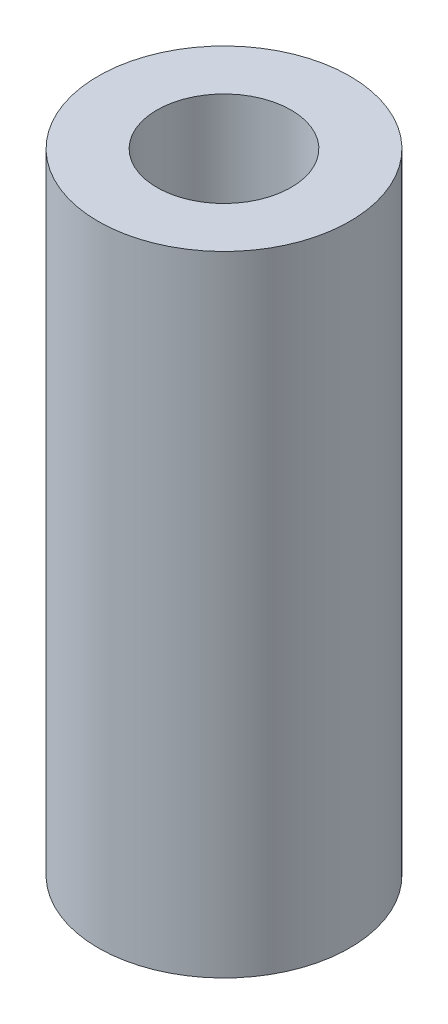
ISO-10303-21;
HEADER;
FILE_DESCRIPTION(('STEP AP214'),'2;1');
FILE_NAME('part.step','',(''),(''),'','','');
FILE_SCHEMA(('AUTOMOTIVE_DESIGN { 1 0 10303 214 1 1 1 1 }'));
ENDSEC;
DATA;
#1=APPLICATION_CONTEXT('core data for automotive mechanical design processes');
#2=APPLICATION_PROTOCOL_DEFINITION('international standard','automotive_design',2000,#1);
#3=PRODUCT_CONTEXT('',#1,'mechanical');
#4=PRODUCT('Part','Part','',(#3));
#5=PRODUCT_RELATED_PRODUCT_CATEGORY('part','',(#4));
#6=PRODUCT_DEFINITION_FORMATION('','',#4);
#7=PRODUCT_DEFINITION_CONTEXT('part definition',#1,'design');
#8=PRODUCT_DEFINITION('design','',#6,#7);
#9=PRODUCT_DEFINITION_SHAPE('','',#8);
#10=(LENGTH_UNIT() NAMED_UNIT(*) SI_UNIT(.MILLI.,.METRE.));
#11=(NAMED_UNIT(*) PLANE_ANGLE_UNIT() SI_UNIT($,.RADIAN.));
#12=(NAMED_UNIT(*) SI_UNIT($,.STERADIAN.) SOLID_ANGLE_UNIT());
#13=UNCERTAINTY_MEASURE_WITH_UNIT(LENGTH_MEASURE(1.E-05),#10,'distance_accuracy_value','');
#14=(GEOMETRIC_REPRESENTATION_CONTEXT(3) GLOBAL_UNCERTAINTY_ASSIGNED_CONTEXT((#13)) GLOBAL_UNIT_ASSIGNED_CONTEXT((#10,
#11,#12)) REPRESENTATION_CONTEXT('',''));
#15=CARTESIAN_POINT('',(0.,0.,0.));
#16=DIRECTION('',(0.,0.,1.));
#17=DIRECTION('',(1.,0.,0.));
#18=AXIS2_PLACEMENT_3D('',#15,#16,#17);
#19=CARTESIAN_POINT('',(0.,75.,0.));
#20=DIRECTION('',(0.,-1.,0.));
#21=DIRECTION('',(0.,0.,-1.));
#22=AXIS2_PLACEMENT_3D('',#19,#20,#21);
#23=CYLINDRICAL_SURFACE('',#22,8.);
#24=CARTESIAN_POINT('',(0.,0.,0.));
#25=DIRECTION('',(0.,-1.,0.));
#26=DIRECTION('',(0.,0.,-1.));
#27=AXIS2_PLACEMENT_3D('',#24,#25,#26);
#28=CIRCLE('',#27,8.);
#29=CARTESIAN_POINT('',(0.,0.,-8.));
#30=VERTEX_POINT('',#29);
#31=EDGE_CURVE('E26',#30,#30,#28,.T.);
#32=ORIENTED_EDGE('',*,*,#31,.T.);
#33=EDGE_LOOP('',(#32));
#34=FACE_BOUND('',#33,.T.);
#35=CARTESIAN_POINT('',(0.,75.,0.));
#36=DIRECTION('',(0.,-1.,0.));
#37=DIRECTION('',(0.,0.,-1.));
#38=AXIS2_PLACEMENT_3D('',#35,#36,#37);
#39=CIRCLE('',#38,8.);
#40=CARTESIAN_POINT('',(0.,75.,-8.));
#41=VERTEX_POINT('',#40);
#42=EDGE_CURVE('E17',#41,#41,#39,.T.);
#43=ORIENTED_EDGE('',*,*,#42,.F.);
#44=EDGE_LOOP('',(#43));
#45=FACE_BOUND('',#44,.T.);
#46=ADVANCED_FACE('F14',(#34,#45),#23,.F.);
#47=CARTESIAN_POINT('',(0.,75.,0.));
#48=DIRECTION('',(0.,1.,0.));
#49=DIRECTION('',(0.,0.,1.));
#50=AXIS2_PLACEMENT_3D('',#47,#48,#49);
#51=PLANE('',#50);
#52=ORIENTED_EDGE('',*,*,#42,.T.);
#53=EDGE_LOOP('',(#52));
#54=FACE_BOUND('',#53,.T.);
#55=CARTESIAN_POINT('',(0.,75.,0.));
#56=DIRECTION('',(0.,-1.,0.));
#57=DIRECTION('',(0.,0.,-1.));
#58=AXIS2_PLACEMENT_3D('',#55,#56,#57);
#59=CIRCLE('',#58,15.);
#60=CARTESIAN_POINT('',(0.,75.,-15.));
#61=VERTEX_POINT('',#60);
#62=EDGE_CURVE('E21',#61,#61,#59,.T.);
#63=ORIENTED_EDGE('',*,*,#62,.F.);
#64=EDGE_LOOP('',(#63));
#65=FACE_BOUND('',#64,.T.);
#66=ADVANCED_FACE('F34',(#54,#65),#51,.T.);
#67=CARTESIAN_POINT('',(0.,0.,0.));
#68=DIRECTION('',(0.,1.,0.));
#69=DIRECTION('',(0.,0.,1.));
#70=AXIS2_PLACEMENT_3D('',#67,#68,#69);
#71=PLANE('',#70);
#72=ORIENTED_EDGE('',*,*,#31,.F.);
#73=EDGE_LOOP('',(#72));
#74=FACE_BOUND('',#73,.T.);
#75=CARTESIAN_POINT('',(0.,0.,0.));
#76=DIRECTION('',(0.,-1.,0.));
#77=DIRECTION('',(0.,0.,-1.));
#78=AXIS2_PLACEMENT_3D('',#75,#76,#77);
#79=CIRCLE('',#78,15.);
#80=CARTESIAN_POINT('',(0.,0.,-15.));
#81=VERTEX_POINT('',#80);
#82=EDGE_CURVE('E10',#81,#81,#79,.F.);
#83=ORIENTED_EDGE('',*,*,#82,.F.);
#84=EDGE_LOOP('',(#83));
#85=FACE_BOUND('',#84,.T.);
#86=ADVANCED_FACE('F43',(#74,#85),#71,.F.);
#87=CARTESIAN_POINT('',(0.,75.,0.));
#88=DIRECTION('',(0.,-1.,0.));
#89=DIRECTION('',(0.,0.,-1.));
#90=AXIS2_PLACEMENT_3D('',#87,#88,#89);
#91=CYLINDRICAL_SURFACE('',#90,15.);
#92=ORIENTED_EDGE('',*,*,#82,.T.);
#93=EDGE_LOOP('',(#92));
#94=FACE_BOUND('',#93,.T.);
#95=ORIENTED_EDGE('',*,*,#62,.T.);
#96=EDGE_LOOP('',(#95));
#97=FACE_BOUND('',#96,.T.);
#98=ADVANCED_FACE('F44',(#94,#97),#91,.T.);
#99=CLOSED_SHELL('',(#46,#66,#86,#98));
#100=MANIFOLD_SOLID_BREP('B1',#99);
#101=ADVANCED_BREP_SHAPE_REPRESENTATION('',(#18,#100),#14);
#102=SHAPE_DEFINITION_REPRESENTATION(#9,#101);
ENDSEC;
END-ISO-10303-21;
